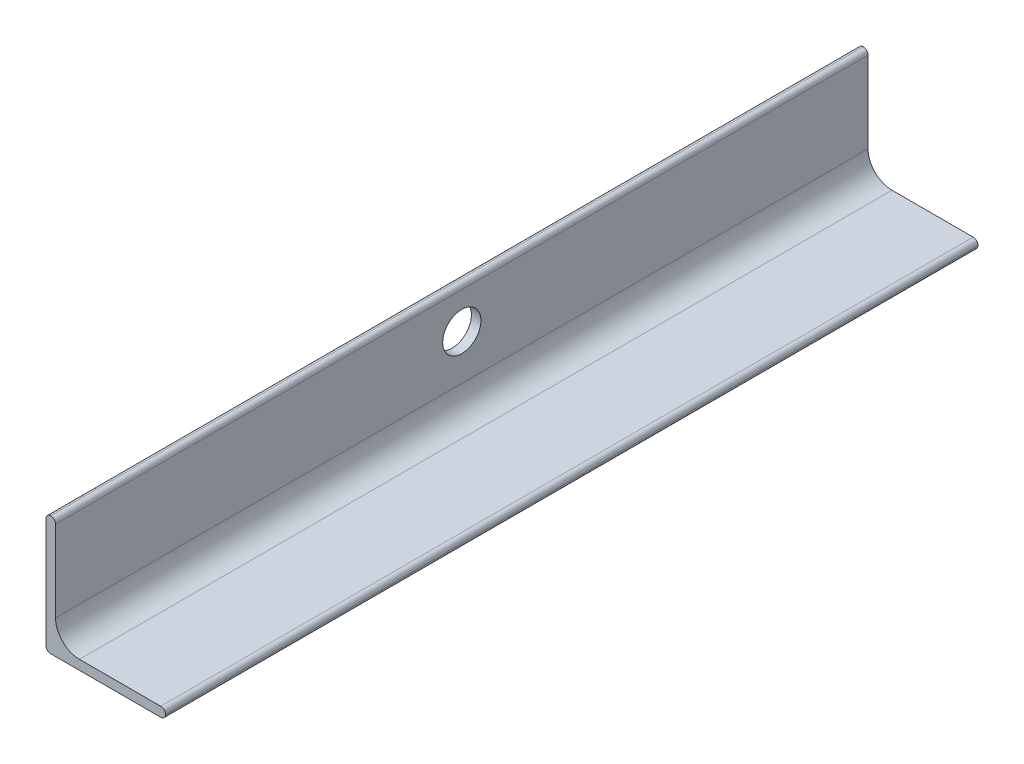
ISO-10303-21;
HEADER;
FILE_DESCRIPTION(('STEP AP214'),'2;1');
FILE_NAME('part.step','',(''),(''),'','','');
FILE_SCHEMA(('AUTOMOTIVE_DESIGN { 1 0 10303 214 1 1 1 1 }'));
ENDSEC;
DATA;
#1=APPLICATION_CONTEXT('core data for automotive mechanical design processes');
#2=APPLICATION_PROTOCOL_DEFINITION('international standard','automotive_design',2000,#1);
#3=PRODUCT_CONTEXT('',#1,'mechanical');
#4=PRODUCT('Part','Part','',(#3));
#5=PRODUCT_RELATED_PRODUCT_CATEGORY('part','',(#4));
#6=PRODUCT_DEFINITION_FORMATION('','',#4);
#7=PRODUCT_DEFINITION_CONTEXT('part definition',#1,'design');
#8=PRODUCT_DEFINITION('design','',#6,#7);
#9=PRODUCT_DEFINITION_SHAPE('','',#8);
#10=(LENGTH_UNIT() NAMED_UNIT(*) SI_UNIT(.MILLI.,.METRE.));
#11=(NAMED_UNIT(*) PLANE_ANGLE_UNIT() SI_UNIT($,.RADIAN.));
#12=(NAMED_UNIT(*) SI_UNIT($,.STERADIAN.) SOLID_ANGLE_UNIT());
#13=UNCERTAINTY_MEASURE_WITH_UNIT(LENGTH_MEASURE(1.E-05),#10,'distance_accuracy_value','');
#14=(GEOMETRIC_REPRESENTATION_CONTEXT(3) GLOBAL_UNCERTAINTY_ASSIGNED_CONTEXT((#13)) GLOBAL_UNIT_ASSIGNED_CONTEXT((#10,
#11,#12)) REPRESENTATION_CONTEXT('',''));
#15=CARTESIAN_POINT('',(0.,0.,0.));
#16=DIRECTION('',(0.,0.,1.));
#17=DIRECTION('',(1.,0.,0.));
#18=AXIS2_PLACEMENT_3D('',#15,#16,#17);
#19=CARTESIAN_POINT('',(0.,25.,170.));
#20=DIRECTION('',(1.,0.,0.));
#21=DIRECTION('',(0.,0.,-1.));
#22=AXIS2_PLACEMENT_3D('',#19,#20,#21);
#23=PLANE('',#22);
#24=CARTESIAN_POINT('',(0.,16.4018857547871,85.));
#25=DIRECTION('',(1.,0.,0.));
#26=DIRECTION('',(0.,1.,0.));
#27=AXIS2_PLACEMENT_3D('',#24,#25,#26);
#28=CIRCLE('',#27,4.00000000000001);
#29=CARTESIAN_POINT('',(0.,20.4018857547871,85.));
#30=VERTEX_POINT('',#29);
#31=EDGE_CURVE('E224',#30,#30,#28,.T.);
#32=ORIENTED_EDGE('',*,*,#31,.T.);
#33=EDGE_LOOP('',(#32));
#34=FACE_BOUND('',#33,.T.);
#35=DIRECTION('',(0.,-1.,0.));
#36=VECTOR('',#35,1.);
#37=CARTESIAN_POINT('',(0.,25.,170.));
#38=LINE('',#37,#36);
#39=CARTESIAN_POINT('',(0.,24.,170.));
#40=VERTEX_POINT('',#39);
#41=CARTESIAN_POINT('',(0.,1.,170.));
#42=VERTEX_POINT('',#41);
#43=EDGE_CURVE('E173',#40,#42,#38,.T.);
#44=ORIENTED_EDGE('',*,*,#43,.F.);
#45=DIRECTION('',(0.,0.,-1.));
#46=VECTOR('',#45,1.);
#47=CARTESIAN_POINT('',(0.,24.,170.));
#48=LINE('',#47,#46);
#49=CARTESIAN_POINT('',(0.,24.,0.));
#50=VERTEX_POINT('',#49);
#51=EDGE_CURVE('E178',#40,#50,#48,.T.);
#52=ORIENTED_EDGE('',*,*,#51,.T.);
#53=DIRECTION('',(0.,-1.,0.));
#54=VECTOR('',#53,1.);
#55=CARTESIAN_POINT('',(0.,25.,0.));
#56=LINE('',#55,#54);
#57=CARTESIAN_POINT('',(0.,1.,0.));
#58=VERTEX_POINT('',#57);
#59=EDGE_CURVE('E156',#50,#58,#56,.T.);
#60=ORIENTED_EDGE('',*,*,#59,.T.);
#61=DIRECTION('',(0.,0.,-1.));
#62=VECTOR('',#61,1.);
#63=CARTESIAN_POINT('',(0.,1.,170.));
#64=LINE('',#63,#62);
#65=EDGE_CURVE('E144',#58,#42,#64,.F.);
#66=ORIENTED_EDGE('',*,*,#65,.T.);
#67=EDGE_LOOP('',(#44,#52,#60,#66));
#68=FACE_BOUND('',#67,.T.);
#69=ADVANCED_FACE('F44',(#34,#68),#23,.F.);
#70=CARTESIAN_POINT('',(0.,0.,170.));
#71=DIRECTION('',(0.,1.,0.));
#72=DIRECTION('',(0.,0.,1.));
#73=AXIS2_PLACEMENT_3D('',#70,#71,#72);
#74=PLANE('',#73);
#75=DIRECTION('',(1.,0.,0.));
#76=VECTOR('',#75,1.);
#77=CARTESIAN_POINT('',(0.,0.,0.));
#78=LINE('',#77,#76);
#79=CARTESIAN_POINT('',(1.,0.,0.));
#80=VERTEX_POINT('',#79);
#81=CARTESIAN_POINT('',(24.,0.,0.));
#82=VERTEX_POINT('',#81);
#83=EDGE_CURVE('E160',#80,#82,#78,.T.);
#84=ORIENTED_EDGE('',*,*,#83,.T.);
#85=DIRECTION('',(0.,0.,-1.));
#86=VECTOR('',#85,1.);
#87=CARTESIAN_POINT('',(24.,0.,170.));
#88=LINE('',#87,#86);
#89=CARTESIAN_POINT('',(24.,0.,170.));
#90=VERTEX_POINT('',#89);
#91=EDGE_CURVE('E54',#82,#90,#88,.F.);
#92=ORIENTED_EDGE('',*,*,#91,.T.);
#93=DIRECTION('',(1.,0.,0.));
#94=VECTOR('',#93,1.);
#95=CARTESIAN_POINT('',(0.,0.,170.));
#96=LINE('',#95,#94);
#97=CARTESIAN_POINT('',(1.,0.,170.));
#98=VERTEX_POINT('',#97);
#99=EDGE_CURVE('E134',#98,#90,#96,.T.);
#100=ORIENTED_EDGE('',*,*,#99,.F.);
#101=DIRECTION('',(0.,0.,-1.));
#102=VECTOR('',#101,1.);
#103=CARTESIAN_POINT('',(1.,0.,170.));
#104=LINE('',#103,#102);
#105=EDGE_CURVE('E213',#98,#80,#104,.T.);
#106=ORIENTED_EDGE('',*,*,#105,.T.);
#107=EDGE_LOOP('',(#84,#92,#100,#106));
#108=FACE_BOUND('',#107,.T.);
#109=ADVANCED_FACE('F266',(#108),#74,.F.);
#110=CARTESIAN_POINT('',(25.,2.,170.));
#111=DIRECTION('',(0.,-1.,0.));
#112=DIRECTION('',(1.,0.,0.));
#113=AXIS2_PLACEMENT_3D('',#110,#111,#112);
#114=PLANE('',#113);
#115=DIRECTION('',(-1.,0.,0.));
#116=VECTOR('',#115,1.);
#117=CARTESIAN_POINT('',(25.,2.,170.));
#118=LINE('',#117,#116);
#119=CARTESIAN_POINT('',(24.,2.,170.));
#120=VERTEX_POINT('',#119);
#121=CARTESIAN_POINT('',(7.00000000000004,2.,170.));
#122=VERTEX_POINT('',#121);
#123=EDGE_CURVE('E122',#120,#122,#118,.T.);
#124=ORIENTED_EDGE('',*,*,#123,.F.);
#125=DIRECTION('',(0.,0.,-1.));
#126=VECTOR('',#125,1.);
#127=CARTESIAN_POINT('',(24.,2.,170.));
#128=LINE('',#127,#126);
#129=CARTESIAN_POINT('',(24.,2.,0.));
#130=VERTEX_POINT('',#129);
#131=EDGE_CURVE('E210',#120,#130,#128,.T.);
#132=ORIENTED_EDGE('',*,*,#131,.T.);
#133=DIRECTION('',(-1.,0.,0.));
#134=VECTOR('',#133,1.);
#135=CARTESIAN_POINT('',(25.,2.,0.));
#136=LINE('',#135,#134);
#137=CARTESIAN_POINT('',(7.00000000000004,2.,0.));
#138=VERTEX_POINT('',#137);
#139=EDGE_CURVE('E140',#130,#138,#136,.T.);
#140=ORIENTED_EDGE('',*,*,#139,.T.);
#141=DIRECTION('',(0.,0.,-1.));
#142=VECTOR('',#141,1.);
#143=CARTESIAN_POINT('',(7.00000000000004,2.,170.));
#144=LINE('',#143,#142);
#145=EDGE_CURVE('E137',#122,#138,#144,.T.);
#146=ORIENTED_EDGE('',*,*,#145,.F.);
#147=EDGE_LOOP('',(#124,#132,#140,#146));
#148=FACE_BOUND('',#147,.T.);
#149=ADVANCED_FACE('F138',(#148),#114,.F.);
#150=CARTESIAN_POINT('',(7.,7.,170.));
#151=DIRECTION('',(0.,0.,-1.));
#152=DIRECTION('',(-1.,0.,0.));
#153=AXIS2_PLACEMENT_3D('',#150,#151,#152);
#154=CYLINDRICAL_SURFACE('',#153,5.);
#155=CARTESIAN_POINT('',(7.,7.,0.));
#156=DIRECTION('',(0.,0.,-1.));
#157=DIRECTION('',(-1.,0.,0.));
#158=AXIS2_PLACEMENT_3D('',#155,#156,#157);
#159=CIRCLE('',#158,5.);
#160=CARTESIAN_POINT('',(2.,7.,0.));
#161=VERTEX_POINT('',#160);
#162=EDGE_CURVE('E167',#138,#161,#159,.T.);
#163=ORIENTED_EDGE('',*,*,#162,.T.);
#164=DIRECTION('',(0.,0.,-1.));
#165=VECTOR('',#164,1.);
#166=CARTESIAN_POINT('',(2.,7.,170.));
#167=LINE('',#166,#165);
#168=CARTESIAN_POINT('',(2.,7.,170.));
#169=VERTEX_POINT('',#168);
#170=EDGE_CURVE('E145',#169,#161,#167,.T.);
#171=ORIENTED_EDGE('',*,*,#170,.F.);
#172=CARTESIAN_POINT('',(7.,7.,170.));
#173=DIRECTION('',(0.,0.,-1.));
#174=DIRECTION('',(-1.,0.,0.));
#175=AXIS2_PLACEMENT_3D('',#172,#173,#174);
#176=CIRCLE('',#175,5.);
#177=EDGE_CURVE('E126',#122,#169,#176,.T.);
#178=ORIENTED_EDGE('',*,*,#177,.F.);
#179=ORIENTED_EDGE('',*,*,#145,.T.);
#180=EDGE_LOOP('',(#163,#171,#178,#179));
#181=FACE_BOUND('',#180,.T.);
#182=ADVANCED_FACE('F147',(#181),#154,.F.);
#183=CARTESIAN_POINT('',(2.,7.00000000000003,170.));
#184=DIRECTION('',(-1.,0.,0.));
#185=DIRECTION('',(0.,-1.,0.));
#186=AXIS2_PLACEMENT_3D('',#183,#184,#185);
#187=PLANE('',#186);
#188=CARTESIAN_POINT('',(2.,16.4018857547871,85.));
#189=DIRECTION('',(1.,0.,0.));
#190=DIRECTION('',(0.,1.,0.));
#191=AXIS2_PLACEMENT_3D('',#188,#189,#190);
#192=CIRCLE('',#191,4.00000000000001);
#193=CARTESIAN_POINT('',(2.,20.4018857547871,85.));
#194=VERTEX_POINT('',#193);
#195=EDGE_CURVE('E229',#194,#194,#192,.T.);
#196=ORIENTED_EDGE('',*,*,#195,.F.);
#197=EDGE_LOOP('',(#196));
#198=FACE_BOUND('',#197,.T.);
#199=DIRECTION('',(0.,1.,0.));
#200=VECTOR('',#199,1.);
#201=CARTESIAN_POINT('',(2.,7.00000000000003,0.));
#202=LINE('',#201,#200);
#203=CARTESIAN_POINT('',(2.,24.,0.));
#204=VERTEX_POINT('',#203);
#205=EDGE_CURVE('E170',#161,#204,#202,.T.);
#206=ORIENTED_EDGE('',*,*,#205,.T.);
#207=DIRECTION('',(0.,0.,-1.));
#208=VECTOR('',#207,1.);
#209=CARTESIAN_POINT('',(2.,24.,170.));
#210=LINE('',#209,#208);
#211=CARTESIAN_POINT('',(2.,24.,170.));
#212=VERTEX_POINT('',#211);
#213=EDGE_CURVE('E11',#204,#212,#210,.F.);
#214=ORIENTED_EDGE('',*,*,#213,.T.);
#215=DIRECTION('',(0.,1.,0.));
#216=VECTOR('',#215,1.);
#217=CARTESIAN_POINT('',(2.,7.00000000000003,170.));
#218=LINE('',#217,#216);
#219=EDGE_CURVE('E150',#169,#212,#218,.T.);
#220=ORIENTED_EDGE('',*,*,#219,.F.);
#221=ORIENTED_EDGE('',*,*,#170,.T.);
#222=EDGE_LOOP('',(#206,#214,#220,#221));
#223=FACE_BOUND('',#222,.T.);
#224=ADVANCED_FACE('F254',(#198,#223),#187,.F.);
#225=CARTESIAN_POINT('',(7.,7.,170.));
#226=DIRECTION('',(0.,0.,-1.));
#227=DIRECTION('',(-1.,0.,0.));
#228=AXIS2_PLACEMENT_3D('',#225,#226,#227);
#229=PLANE('',#228);
#230=CARTESIAN_POINT('',(24.,1.,170.));
#231=DIRECTION('',(0.,0.,-1.));
#232=DIRECTION('',(-1.,0.,0.));
#233=AXIS2_PLACEMENT_3D('',#230,#231,#232);
#234=CIRCLE('',#233,1.);
#235=CARTESIAN_POINT('',(25.,1.,170.));
#236=VERTEX_POINT('',#235);
#237=EDGE_CURVE('E205',#90,#236,#234,.F.);
#238=ORIENTED_EDGE('',*,*,#237,.T.);
#239=CARTESIAN_POINT('',(24.,1.,170.));
#240=DIRECTION('',(0.,0.,-1.));
#241=DIRECTION('',(-1.,0.,0.));
#242=AXIS2_PLACEMENT_3D('',#239,#240,#241);
#243=CIRCLE('',#242,1.);
#244=EDGE_CURVE('E129',#236,#120,#243,.F.);
#245=ORIENTED_EDGE('',*,*,#244,.T.);
#246=ORIENTED_EDGE('',*,*,#123,.T.);
#247=ORIENTED_EDGE('',*,*,#177,.T.);
#248=ORIENTED_EDGE('',*,*,#219,.T.);
#249=CARTESIAN_POINT('',(1.,24.,170.));
#250=DIRECTION('',(0.,0.,-1.));
#251=DIRECTION('',(-1.,0.,0.));
#252=AXIS2_PLACEMENT_3D('',#249,#250,#251);
#253=CIRCLE('',#252,1.);
#254=CARTESIAN_POINT('',(1.,25.,170.));
#255=VERTEX_POINT('',#254);
#256=EDGE_CURVE('E62',#212,#255,#253,.F.);
#257=ORIENTED_EDGE('',*,*,#256,.T.);
#258=CARTESIAN_POINT('',(1.,24.,170.));
#259=DIRECTION('',(0.,0.,-1.));
#260=DIRECTION('',(-1.,0.,0.));
#261=AXIS2_PLACEMENT_3D('',#258,#259,#260);
#262=CIRCLE('',#261,1.);
#263=EDGE_CURVE('E199',#255,#40,#262,.F.);
#264=ORIENTED_EDGE('',*,*,#263,.T.);
#265=ORIENTED_EDGE('',*,*,#43,.T.);
#266=CARTESIAN_POINT('',(1.,1.,170.));
#267=DIRECTION('',(0.,0.,-1.));
#268=DIRECTION('',(-1.,0.,0.));
#269=AXIS2_PLACEMENT_3D('',#266,#267,#268);
#270=CIRCLE('',#269,1.);
#271=EDGE_CURVE('E202',#42,#98,#270,.F.);
#272=ORIENTED_EDGE('',*,*,#271,.T.);
#273=ORIENTED_EDGE('',*,*,#99,.T.);
#274=EDGE_LOOP('',(#238,#245,#246,#247,#248,#257,#264,#265,#272,#273));
#275=FACE_BOUND('',#274,.T.);
#276=ADVANCED_FACE('F124',(#275),#229,.F.);
#277=CARTESIAN_POINT('',(7.,7.,0.));
#278=DIRECTION('',(0.,0.,-1.));
#279=DIRECTION('',(-1.,0.,0.));
#280=AXIS2_PLACEMENT_3D('',#277,#278,#279);
#281=PLANE('',#280);
#282=ORIENTED_EDGE('',*,*,#139,.F.);
#283=CARTESIAN_POINT('',(24.,1.,0.));
#284=DIRECTION('',(0.,0.,-1.));
#285=DIRECTION('',(-1.,0.,0.));
#286=AXIS2_PLACEMENT_3D('',#283,#284,#285);
#287=CIRCLE('',#286,1.);
#288=CARTESIAN_POINT('',(25.,1.,0.));
#289=VERTEX_POINT('',#288);
#290=EDGE_CURVE('E194',#130,#289,#287,.T.);
#291=ORIENTED_EDGE('',*,*,#290,.T.);
#292=CARTESIAN_POINT('',(24.,1.,0.));
#293=DIRECTION('',(0.,0.,-1.));
#294=DIRECTION('',(-1.,0.,0.));
#295=AXIS2_PLACEMENT_3D('',#292,#293,#294);
#296=CIRCLE('',#295,1.);
#297=EDGE_CURVE('E191',#289,#82,#296,.T.);
#298=ORIENTED_EDGE('',*,*,#297,.T.);
#299=ORIENTED_EDGE('',*,*,#83,.F.);
#300=CARTESIAN_POINT('',(1.,1.,0.));
#301=DIRECTION('',(0.,0.,-1.));
#302=DIRECTION('',(-1.,0.,0.));
#303=AXIS2_PLACEMENT_3D('',#300,#301,#302);
#304=CIRCLE('',#303,1.);
#305=EDGE_CURVE('E188',#80,#58,#304,.T.);
#306=ORIENTED_EDGE('',*,*,#305,.T.);
#307=ORIENTED_EDGE('',*,*,#59,.F.);
#308=CARTESIAN_POINT('',(1.,24.,0.));
#309=DIRECTION('',(0.,0.,-1.));
#310=DIRECTION('',(-1.,0.,0.));
#311=AXIS2_PLACEMENT_3D('',#308,#309,#310);
#312=CIRCLE('',#311,1.);
#313=CARTESIAN_POINT('',(1.,25.,0.));
#314=VERTEX_POINT('',#313);
#315=EDGE_CURVE('E185',#50,#314,#312,.T.);
#316=ORIENTED_EDGE('',*,*,#315,.T.);
#317=CARTESIAN_POINT('',(1.,24.,0.));
#318=DIRECTION('',(0.,0.,-1.));
#319=DIRECTION('',(-1.,0.,0.));
#320=AXIS2_PLACEMENT_3D('',#317,#318,#319);
#321=CIRCLE('',#320,1.);
#322=EDGE_CURVE('E182',#314,#204,#321,.T.);
#323=ORIENTED_EDGE('',*,*,#322,.T.);
#324=ORIENTED_EDGE('',*,*,#205,.F.);
#325=ORIENTED_EDGE('',*,*,#162,.F.);
#326=EDGE_LOOP('',(#282,#291,#298,#299,#306,#307,#316,#323,#324,#325));
#327=FACE_BOUND('',#326,.T.);
#328=ADVANCED_FACE('F252',(#327),#281,.T.);
#329=CARTESIAN_POINT('',(1.,24.,170.));
#330=DIRECTION('',(0.,0.,-1.));
#331=DIRECTION('',(-1.,0.,0.));
#332=AXIS2_PLACEMENT_3D('',#329,#330,#331);
#333=CYLINDRICAL_SURFACE('',#332,1.);
#334=DIRECTION('',(0.,0.,-1.));
#335=VECTOR('',#334,1.);
#336=CARTESIAN_POINT('',(1.,25.,170.));
#337=LINE('',#336,#335);
#338=EDGE_CURVE('E161',#255,#314,#337,.T.);
#339=ORIENTED_EDGE('',*,*,#338,.F.);
#340=ORIENTED_EDGE('',*,*,#256,.F.);
#341=ORIENTED_EDGE('',*,*,#213,.F.);
#342=ORIENTED_EDGE('',*,*,#322,.F.);
#343=EDGE_LOOP('',(#339,#340,#341,#342));
#344=FACE_BOUND('',#343,.T.);
#345=ADVANCED_FACE('F256',(#344),#333,.T.);
#346=CARTESIAN_POINT('',(1.,24.,170.));
#347=DIRECTION('',(0.,0.,-1.));
#348=DIRECTION('',(-1.,0.,0.));
#349=AXIS2_PLACEMENT_3D('',#346,#347,#348);
#350=CYLINDRICAL_SURFACE('',#349,1.);
#351=ORIENTED_EDGE('',*,*,#263,.F.);
#352=ORIENTED_EDGE('',*,*,#338,.T.);
#353=ORIENTED_EDGE('',*,*,#315,.F.);
#354=ORIENTED_EDGE('',*,*,#51,.F.);
#355=EDGE_LOOP('',(#351,#352,#353,#354));
#356=FACE_BOUND('',#355,.T.);
#357=ADVANCED_FACE('F259',(#356),#350,.T.);
#358=CARTESIAN_POINT('',(24.,1.,170.));
#359=DIRECTION('',(0.,0.,-1.));
#360=DIRECTION('',(-1.,0.,0.));
#361=AXIS2_PLACEMENT_3D('',#358,#359,#360);
#362=CYLINDRICAL_SURFACE('',#361,1.);
#363=DIRECTION('',(0.,0.,-1.));
#364=VECTOR('',#363,1.);
#365=CARTESIAN_POINT('',(25.,1.,170.));
#366=LINE('',#365,#364);
#367=EDGE_CURVE('E48',#236,#289,#366,.T.);
#368=ORIENTED_EDGE('',*,*,#367,.F.);
#369=ORIENTED_EDGE('',*,*,#237,.F.);
#370=ORIENTED_EDGE('',*,*,#91,.F.);
#371=ORIENTED_EDGE('',*,*,#297,.F.);
#372=EDGE_LOOP('',(#368,#369,#370,#371));
#373=FACE_BOUND('',#372,.T.);
#374=ADVANCED_FACE('F248',(#373),#362,.T.);
#375=CARTESIAN_POINT('',(24.,1.,170.));
#376=DIRECTION('',(0.,0.,-1.));
#377=DIRECTION('',(-1.,0.,0.));
#378=AXIS2_PLACEMENT_3D('',#375,#376,#377);
#379=CYLINDRICAL_SURFACE('',#378,1.);
#380=ORIENTED_EDGE('',*,*,#244,.F.);
#381=ORIENTED_EDGE('',*,*,#367,.T.);
#382=ORIENTED_EDGE('',*,*,#290,.F.);
#383=ORIENTED_EDGE('',*,*,#131,.F.);
#384=EDGE_LOOP('',(#380,#381,#382,#383));
#385=FACE_BOUND('',#384,.T.);
#386=ADVANCED_FACE('F250',(#385),#379,.T.);
#387=CARTESIAN_POINT('',(1.,1.,170.));
#388=DIRECTION('',(0.,0.,-1.));
#389=DIRECTION('',(-1.,0.,0.));
#390=AXIS2_PLACEMENT_3D('',#387,#388,#389);
#391=CYLINDRICAL_SURFACE('',#390,1.);
#392=ORIENTED_EDGE('',*,*,#271,.F.);
#393=ORIENTED_EDGE('',*,*,#65,.F.);
#394=ORIENTED_EDGE('',*,*,#305,.F.);
#395=ORIENTED_EDGE('',*,*,#105,.F.);
#396=EDGE_LOOP('',(#392,#393,#394,#395));
#397=FACE_BOUND('',#396,.T.);
#398=ADVANCED_FACE('F46',(#397),#391,.T.);
#399=CARTESIAN_POINT('',(0.,16.4018857547871,85.));
#400=DIRECTION('',(1.,0.,0.));
#401=DIRECTION('',(0.,1.,0.));
#402=AXIS2_PLACEMENT_3D('',#399,#400,#401);
#403=CYLINDRICAL_SURFACE('',#402,4.00000000000001);
#404=ORIENTED_EDGE('',*,*,#31,.F.);
#405=EDGE_LOOP('',(#404));
#406=FACE_BOUND('',#405,.T.);
#407=ORIENTED_EDGE('',*,*,#195,.T.);
#408=EDGE_LOOP('',(#407));
#409=FACE_BOUND('',#408,.T.);
#410=ADVANCED_FACE('F299',(#406,#409),#403,.F.);
#411=CLOSED_SHELL('',(#69,#109,#149,#182,#224,#276,#328,#345,#357,#374,#386,#398,#410));
#412=MANIFOLD_SOLID_BREP('B2',#411);
#413=ADVANCED_BREP_SHAPE_REPRESENTATION('',(#18,#412),#14);
#414=SHAPE_DEFINITION_REPRESENTATION(#9,#413);
ENDSEC;
END-ISO-10303-21;
